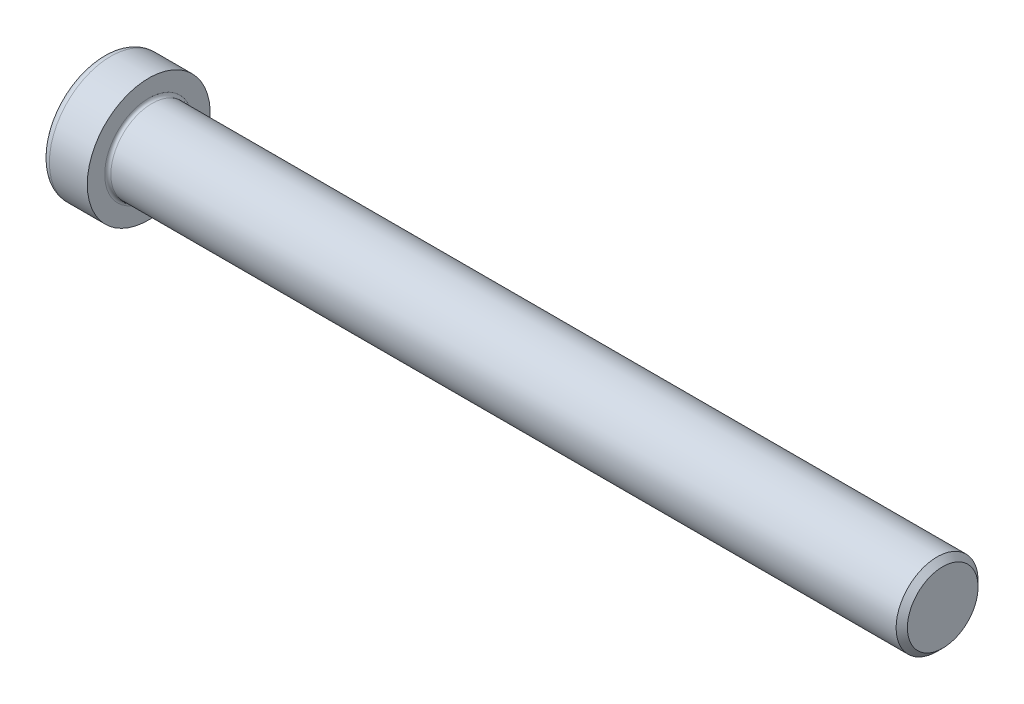
ISO-10303-21;
HEADER;
FILE_DESCRIPTION(('STEP AP214'),'2;1');
FILE_NAME('part.step','',(''),(''),'','','');
FILE_SCHEMA(('AUTOMOTIVE_DESIGN { 1 0 10303 214 1 1 1 1 }'));
ENDSEC;
DATA;
#1=APPLICATION_CONTEXT('core data for automotive mechanical design processes');
#2=APPLICATION_PROTOCOL_DEFINITION('international standard','automotive_design',2000,#1);
#3=PRODUCT_CONTEXT('',#1,'mechanical');
#4=PRODUCT('Part','Part','',(#3));
#5=PRODUCT_RELATED_PRODUCT_CATEGORY('part','',(#4));
#6=PRODUCT_DEFINITION_FORMATION('','',#4);
#7=PRODUCT_DEFINITION_CONTEXT('part definition',#1,'design');
#8=PRODUCT_DEFINITION('design','',#6,#7);
#9=PRODUCT_DEFINITION_SHAPE('','',#8);
#10=(LENGTH_UNIT() NAMED_UNIT(*) SI_UNIT(.MILLI.,.METRE.));
#11=(NAMED_UNIT(*) PLANE_ANGLE_UNIT() SI_UNIT($,.RADIAN.));
#12=(NAMED_UNIT(*) SI_UNIT($,.STERADIAN.) SOLID_ANGLE_UNIT());
#13=UNCERTAINTY_MEASURE_WITH_UNIT(LENGTH_MEASURE(1.E-05),#10,'distance_accuracy_value','');
#14=(GEOMETRIC_REPRESENTATION_CONTEXT(3) GLOBAL_UNCERTAINTY_ASSIGNED_CONTEXT((#13)) GLOBAL_UNIT_ASSIGNED_CONTEXT((#10,
#11,#12)) REPRESENTATION_CONTEXT('',''));
#15=CARTESIAN_POINT('',(0.,0.,0.));
#16=DIRECTION('',(0.,0.,1.));
#17=DIRECTION('',(1.,0.,0.));
#18=AXIS2_PLACEMENT_3D('',#15,#16,#17);
#19=CARTESIAN_POINT('',(0.,0.,0.));
#20=DIRECTION('',(-1.,0.,0.));
#21=DIRECTION('',(0.,0.,1.));
#22=AXIS2_PLACEMENT_3D('',#19,#20,#21);
#23=PLANE('',#22);
#24=DIRECTION('',(0.,-0.499999999999998,0.86602540378444));
#25=VECTOR('',#24,1.);
#26=CARTESIAN_POINT('',(0.,6.92820323027551,0.));
#27=LINE('',#26,#25);
#28=CARTESIAN_POINT('',(0.,6.92820323027551,0.));
#29=VERTEX_POINT('',#28);
#30=CARTESIAN_POINT('',(0.,3.46410161513777,5.99999999999999));
#31=VERTEX_POINT('',#30);
#32=EDGE_CURVE('E294',#29,#31,#27,.T.);
#33=ORIENTED_EDGE('',*,*,#32,.T.);
#34=DIRECTION('',(0.,1.,0.));
#35=VECTOR('',#34,1.);
#36=CARTESIAN_POINT('',(0.,-3.46410161513774,6.));
#37=LINE('',#36,#35);
#38=CARTESIAN_POINT('',(0.,-3.46410161513774,6.));
#39=VERTEX_POINT('',#38);
#40=EDGE_CURVE('E148',#39,#31,#37,.T.);
#41=ORIENTED_EDGE('',*,*,#40,.F.);
#42=DIRECTION('',(0.,-0.500000000000001,-0.866025403784438));
#43=VECTOR('',#42,1.);
#44=CARTESIAN_POINT('',(0.,-3.46410161513774,6.));
#45=LINE('',#44,#43);
#46=CARTESIAN_POINT('',(0.,-6.9282032302755,0.));
#47=VERTEX_POINT('',#46);
#48=EDGE_CURVE('E299',#39,#47,#45,.T.);
#49=ORIENTED_EDGE('',*,*,#48,.T.);
#50=DIRECTION('',(0.,0.499999999999998,-0.86602540378444));
#51=VECTOR('',#50,1.);
#52=CARTESIAN_POINT('',(0.,-6.9282032302755,0.));
#53=LINE('',#52,#51);
#54=CARTESIAN_POINT('',(0.,-3.46410161513776,-6.));
#55=VERTEX_POINT('',#54);
#56=EDGE_CURVE('E303',#47,#55,#53,.T.);
#57=ORIENTED_EDGE('',*,*,#56,.T.);
#58=DIRECTION('',(0.,-1.,0.));
#59=VECTOR('',#58,1.);
#60=CARTESIAN_POINT('',(0.,3.46410161513775,-6.00000000000001));
#61=LINE('',#60,#59);
#62=CARTESIAN_POINT('',(0.,3.46410161513775,-6.00000000000001));
#63=VERTEX_POINT('',#62);
#64=EDGE_CURVE('E307',#63,#55,#61,.T.);
#65=ORIENTED_EDGE('',*,*,#64,.F.);
#66=DIRECTION('',(0.,-0.500000000000001,-0.866025403784438));
#67=VECTOR('',#66,1.);
#68=CARTESIAN_POINT('',(0.,6.92820323027551,0.));
#69=LINE('',#68,#67);
#70=EDGE_CURVE('E143',#29,#63,#69,.T.);
#71=ORIENTED_EDGE('',*,*,#70,.F.);
#72=EDGE_LOOP('',(#33,#41,#49,#57,#65,#71));
#73=FACE_BOUND('',#72,.T.);
#74=CARTESIAN_POINT('',(0.,0.,0.));
#75=DIRECTION('',(-1.,0.,0.));
#76=DIRECTION('',(0.,0.,1.));
#77=AXIS2_PLACEMENT_3D('',#74,#75,#76);
#78=CIRCLE('',#77,10.4);
#79=CARTESIAN_POINT('',(0.,0.,10.4));
#80=VERTEX_POINT('',#79);
#81=EDGE_CURVE('E58',#80,#80,#78,.T.);
#82=ORIENTED_EDGE('',*,*,#81,.T.);
#83=EDGE_LOOP('',(#82));
#84=FACE_BOUND('',#83,.T.);
#85=ADVANCED_FACE('F49',(#73,#84),#23,.T.);
#86=CARTESIAN_POINT('',(-31.75,0.,0.));
#87=DIRECTION('',(-1.,0.,0.));
#88=DIRECTION('',(0.,0.,1.));
#89=AXIS2_PLACEMENT_3D('',#86,#87,#88);
#90=CYLINDRICAL_SURFACE('',#89,12.);
#91=CARTESIAN_POINT('',(1.6,0.,0.));
#92=DIRECTION('',(-1.,0.,0.));
#93=DIRECTION('',(0.,0.,1.));
#94=AXIS2_PLACEMENT_3D('',#91,#92,#93);
#95=CIRCLE('',#94,12.);
#96=CARTESIAN_POINT('',(1.6,0.,12.));
#97=VERTEX_POINT('',#96);
#98=EDGE_CURVE('E11',#97,#97,#95,.F.);
#99=ORIENTED_EDGE('',*,*,#98,.T.);
#100=EDGE_LOOP('',(#99));
#101=FACE_BOUND('',#100,.T.);
#102=CARTESIAN_POINT('',(9.,0.,0.));
#103=DIRECTION('',(-1.,0.,0.));
#104=DIRECTION('',(0.,0.,1.));
#105=AXIS2_PLACEMENT_3D('',#102,#103,#104);
#106=CIRCLE('',#105,12.);
#107=CARTESIAN_POINT('',(9.,0.,12.));
#108=VERTEX_POINT('',#107);
#109=EDGE_CURVE('E173',#108,#108,#106,.T.);
#110=ORIENTED_EDGE('',*,*,#109,.T.);
#111=EDGE_LOOP('',(#110));
#112=FACE_BOUND('',#111,.T.);
#113=ADVANCED_FACE('F203',(#101,#112),#90,.T.);
#114=CARTESIAN_POINT('',(9.,12.,0.));
#115=DIRECTION('',(1.,0.,0.));
#116=DIRECTION('',(0.,0.,-1.));
#117=AXIS2_PLACEMENT_3D('',#114,#115,#116);
#118=PLANE('',#117);
#119=CARTESIAN_POINT('',(9.,0.,0.));
#120=DIRECTION('',(1.,0.,0.));
#121=DIRECTION('',(0.,0.,-1.));
#122=AXIS2_PLACEMENT_3D('',#119,#120,#121);
#123=CIRCLE('',#122,8.6);
#124=CARTESIAN_POINT('',(9.,0.,-8.6));
#125=VERTEX_POINT('',#124);
#126=EDGE_CURVE('E177',#125,#125,#123,.F.);
#127=ORIENTED_EDGE('',*,*,#126,.T.);
#128=EDGE_LOOP('',(#127));
#129=FACE_BOUND('',#128,.T.);
#130=ORIENTED_EDGE('',*,*,#109,.F.);
#131=EDGE_LOOP('',(#130));
#132=FACE_BOUND('',#131,.T.);
#133=ADVANCED_FACE('F208',(#129,#132),#118,.T.);
#134=CARTESIAN_POINT('',(-31.75,0.,0.));
#135=DIRECTION('',(-1.,0.,0.));
#136=DIRECTION('',(0.,0.,1.));
#137=AXIS2_PLACEMENT_3D('',#134,#135,#136);
#138=CYLINDRICAL_SURFACE('',#137,8.);
#139=CARTESIAN_POINT('',(9.6,0.,0.));
#140=DIRECTION('',(1.,0.,0.));
#141=DIRECTION('',(0.,0.,-1.));
#142=AXIS2_PLACEMENT_3D('',#139,#140,#141);
#143=CIRCLE('',#142,8.);
#144=CARTESIAN_POINT('',(9.6,0.,-8.));
#145=VERTEX_POINT('',#144);
#146=EDGE_CURVE('E181',#145,#145,#143,.T.);
#147=ORIENTED_EDGE('',*,*,#146,.T.);
#148=EDGE_LOOP('',(#147));
#149=FACE_BOUND('',#148,.T.);
#150=CARTESIAN_POINT('',(162.8985,0.,0.));
#151=DIRECTION('',(-1.,0.,0.));
#152=DIRECTION('',(0.,0.,1.));
#153=AXIS2_PLACEMENT_3D('',#150,#151,#152);
#154=CIRCLE('',#153,8.);
#155=CARTESIAN_POINT('',(162.8985,0.,8.));
#156=VERTEX_POINT('',#155);
#157=EDGE_CURVE('E169',#156,#156,#154,.T.);
#158=ORIENTED_EDGE('',*,*,#157,.T.);
#159=EDGE_LOOP('',(#158));
#160=FACE_BOUND('',#159,.T.);
#161=ADVANCED_FACE('F214',(#149,#160),#138,.T.);
#162=CARTESIAN_POINT('',(164.,0.,0.));
#163=DIRECTION('',(-1.,0.,0.));
#164=DIRECTION('',(0.,0.,1.));
#165=AXIS2_PLACEMENT_3D('',#162,#163,#164);
#166=CONICAL_SURFACE('',#165,6.8985,0.785398163397432);
#167=ORIENTED_EDGE('',*,*,#157,.F.);
#168=EDGE_LOOP('',(#167));
#169=FACE_BOUND('',#168,.T.);
#170=CARTESIAN_POINT('',(164.,0.,0.));
#171=DIRECTION('',(-1.,0.,0.));
#172=DIRECTION('',(0.,0.,1.));
#173=AXIS2_PLACEMENT_3D('',#170,#171,#172);
#174=CIRCLE('',#173,6.8985);
#175=CARTESIAN_POINT('',(164.,0.,6.8985));
#176=VERTEX_POINT('',#175);
#177=EDGE_CURVE('E164',#176,#176,#174,.T.);
#178=ORIENTED_EDGE('',*,*,#177,.T.);
#179=EDGE_LOOP('',(#178));
#180=FACE_BOUND('',#179,.T.);
#181=ADVANCED_FACE('F218',(#169,#180),#166,.T.);
#182=CARTESIAN_POINT('',(164.,6.8985,0.));
#183=DIRECTION('',(1.,0.,0.));
#184=DIRECTION('',(0.,0.,-1.));
#185=AXIS2_PLACEMENT_3D('',#182,#183,#184);
#186=PLANE('',#185);
#187=ORIENTED_EDGE('',*,*,#177,.F.);
#188=EDGE_LOOP('',(#187));
#189=FACE_BOUND('',#188,.T.);
#190=ADVANCED_FACE('F200',(#189),#186,.T.);
#191=CARTESIAN_POINT('',(9.6,0.,0.));
#192=DIRECTION('',(1.,0.,0.));
#193=DIRECTION('',(0.,0.,-1.));
#194=AXIS2_PLACEMENT_3D('',#191,#192,#193);
#195=TOROIDAL_SURFACE('',#194,8.6,0.6);
#196=ORIENTED_EDGE('',*,*,#146,.F.);
#197=EDGE_LOOP('',(#196));
#198=FACE_BOUND('',#197,.T.);
#199=ORIENTED_EDGE('',*,*,#126,.F.);
#200=EDGE_LOOP('',(#199));
#201=FACE_BOUND('',#200,.T.);
#202=ADVANCED_FACE('F191',(#198,#201),#195,.F.);
#203=CARTESIAN_POINT('',(1.6,0.,0.));
#204=DIRECTION('',(-1.,0.,0.));
#205=DIRECTION('',(0.,0.,1.));
#206=AXIS2_PLACEMENT_3D('',#203,#204,#205);
#207=TOROIDAL_SURFACE('',#206,10.4,1.6);
#208=ORIENTED_EDGE('',*,*,#98,.F.);
#209=EDGE_LOOP('',(#208));
#210=FACE_BOUND('',#209,.T.);
#211=ORIENTED_EDGE('',*,*,#81,.F.);
#212=EDGE_LOOP('',(#211));
#213=FACE_BOUND('',#212,.T.);
#214=ADVANCED_FACE('F51',(#210,#213),#207,.T.);
#215=CARTESIAN_POINT('',(5.5,6.92820323027551,0.));
#216=DIRECTION('',(0.,-0.86602540378444,-0.499999999999998));
#217=DIRECTION('',(0.,0.499999999999998,-0.86602540378444));
#218=AXIS2_PLACEMENT_3D('',#215,#216,#217);
#219=PLANE('',#218);
#220=ORIENTED_EDGE('',*,*,#32,.F.);
#221=DIRECTION('',(-1.,0.,0.));
#222=VECTOR('',#221,1.);
#223=CARTESIAN_POINT('',(5.5,6.92820323027551,0.));
#224=LINE('',#223,#222);
#225=CARTESIAN_POINT('',(5.5,6.92820323027551,0.));
#226=VERTEX_POINT('',#225);
#227=EDGE_CURVE('E280',#226,#29,#224,.T.);
#228=ORIENTED_EDGE('',*,*,#227,.F.);
#229=DIRECTION('',(0.,-0.499999999999998,0.86602540378444));
#230=VECTOR('',#229,1.);
#231=CARTESIAN_POINT('',(5.5,6.92820323027551,0.));
#232=LINE('',#231,#230);
#233=CARTESIAN_POINT('',(5.5,5.19615242270664,2.99999999999999));
#234=VERTEX_POINT('',#233);
#235=EDGE_CURVE('E134',#226,#234,#232,.T.);
#236=ORIENTED_EDGE('',*,*,#235,.T.);
#237=CARTESIAN_POINT('',(5.5,3.46410161513777,5.99999999999999));
#238=VERTEX_POINT('',#237);
#239=EDGE_CURVE('E124',#234,#238,#232,.T.);
#240=ORIENTED_EDGE('',*,*,#239,.T.);
#241=DIRECTION('',(-1.,0.,0.));
#242=VECTOR('',#241,1.);
#243=CARTESIAN_POINT('',(5.5,3.46410161513777,5.99999999999999));
#244=LINE('',#243,#242);
#245=EDGE_CURVE('E139',#238,#31,#244,.T.);
#246=ORIENTED_EDGE('',*,*,#245,.T.);
#247=EDGE_LOOP('',(#220,#228,#236,#240,#246));
#248=FACE_BOUND('',#247,.T.);
#249=ADVANCED_FACE('F138',(#248),#219,.T.);
#250=CARTESIAN_POINT('',(5.5,-3.46410161513774,6.));
#251=DIRECTION('',(0.,0.,1.));
#252=DIRECTION('',(0.,-1.,0.));
#253=AXIS2_PLACEMENT_3D('',#250,#251,#252);
#254=PLANE('',#253);
#255=ORIENTED_EDGE('',*,*,#40,.T.);
#256=ORIENTED_EDGE('',*,*,#245,.F.);
#257=DIRECTION('',(0.,1.,0.));
#258=VECTOR('',#257,1.);
#259=CARTESIAN_POINT('',(5.5,-3.46410161513774,6.));
#260=LINE('',#259,#258);
#261=CARTESIAN_POINT('',(5.5,0.,6.));
#262=VERTEX_POINT('',#261);
#263=EDGE_CURVE('E121',#262,#238,#260,.T.);
#264=ORIENTED_EDGE('',*,*,#263,.F.);
#265=CARTESIAN_POINT('',(5.5,-3.46410161513774,6.));
#266=VERTEX_POINT('',#265);
#267=EDGE_CURVE('E133',#266,#262,#260,.T.);
#268=ORIENTED_EDGE('',*,*,#267,.F.);
#269=DIRECTION('',(-1.,0.,0.));
#270=VECTOR('',#269,1.);
#271=CARTESIAN_POINT('',(5.5,-3.46410161513774,6.));
#272=LINE('',#271,#270);
#273=EDGE_CURVE('E151',#266,#39,#272,.T.);
#274=ORIENTED_EDGE('',*,*,#273,.T.);
#275=EDGE_LOOP('',(#255,#256,#264,#268,#274));
#276=FACE_BOUND('',#275,.T.);
#277=ADVANCED_FACE('F145',(#276),#254,.F.);
#278=CARTESIAN_POINT('',(5.5,-3.46410161513774,6.));
#279=DIRECTION('',(0.,0.866025403784438,-0.500000000000001));
#280=DIRECTION('',(0.,0.500000000000001,0.866025403784438));
#281=AXIS2_PLACEMENT_3D('',#278,#279,#280);
#282=PLANE('',#281);
#283=ORIENTED_EDGE('',*,*,#48,.F.);
#284=ORIENTED_EDGE('',*,*,#273,.F.);
#285=DIRECTION('',(0.,-0.500000000000001,-0.866025403784438));
#286=VECTOR('',#285,1.);
#287=CARTESIAN_POINT('',(5.5,-3.46410161513774,6.));
#288=LINE('',#287,#286);
#289=CARTESIAN_POINT('',(5.5,-5.19615242270662,3.));
#290=VERTEX_POINT('',#289);
#291=EDGE_CURVE('E342',#266,#290,#288,.T.);
#292=ORIENTED_EDGE('',*,*,#291,.T.);
#293=CARTESIAN_POINT('',(5.5,-6.9282032302755,0.));
#294=VERTEX_POINT('',#293);
#295=EDGE_CURVE('E322',#290,#294,#288,.T.);
#296=ORIENTED_EDGE('',*,*,#295,.T.);
#297=DIRECTION('',(-1.,0.,0.));
#298=VECTOR('',#297,1.);
#299=CARTESIAN_POINT('',(5.5,-6.9282032302755,0.));
#300=LINE('',#299,#298);
#301=EDGE_CURVE('E159',#294,#47,#300,.T.);
#302=ORIENTED_EDGE('',*,*,#301,.T.);
#303=EDGE_LOOP('',(#283,#284,#292,#296,#302));
#304=FACE_BOUND('',#303,.T.);
#305=ADVANCED_FACE('F232',(#304),#282,.T.);
#306=CARTESIAN_POINT('',(5.5,-6.9282032302755,0.));
#307=DIRECTION('',(0.,0.86602540378444,0.499999999999998));
#308=DIRECTION('',(0.,-0.499999999999998,0.86602540378444));
#309=AXIS2_PLACEMENT_3D('',#306,#307,#308);
#310=PLANE('',#309);
#311=ORIENTED_EDGE('',*,*,#56,.F.);
#312=ORIENTED_EDGE('',*,*,#301,.F.);
#313=DIRECTION('',(0.,0.499999999999998,-0.86602540378444));
#314=VECTOR('',#313,1.);
#315=CARTESIAN_POINT('',(5.5,-6.9282032302755,0.));
#316=LINE('',#315,#314);
#317=CARTESIAN_POINT('',(5.5,-5.19615242270664,-2.99999999999998));
#318=VERTEX_POINT('',#317);
#319=EDGE_CURVE('E289',#294,#318,#316,.T.);
#320=ORIENTED_EDGE('',*,*,#319,.T.);
#321=CARTESIAN_POINT('',(5.5,-3.46410161513776,-6.));
#322=VERTEX_POINT('',#321);
#323=EDGE_CURVE('E340',#318,#322,#316,.T.);
#324=ORIENTED_EDGE('',*,*,#323,.T.);
#325=DIRECTION('',(-1.,0.,0.));
#326=VECTOR('',#325,1.);
#327=CARTESIAN_POINT('',(5.5,-3.46410161513776,-6.));
#328=LINE('',#327,#326);
#329=EDGE_CURVE('E279',#322,#55,#328,.T.);
#330=ORIENTED_EDGE('',*,*,#329,.T.);
#331=EDGE_LOOP('',(#311,#312,#320,#324,#330));
#332=FACE_BOUND('',#331,.T.);
#333=ADVANCED_FACE('F235',(#332),#310,.T.);
#334=CARTESIAN_POINT('',(5.5,3.46410161513775,-6.00000000000001));
#335=DIRECTION('',(0.,0.,-1.));
#336=DIRECTION('',(0.,1.,0.));
#337=AXIS2_PLACEMENT_3D('',#334,#335,#336);
#338=PLANE('',#337);
#339=ORIENTED_EDGE('',*,*,#64,.T.);
#340=ORIENTED_EDGE('',*,*,#329,.F.);
#341=DIRECTION('',(0.,-1.,0.));
#342=VECTOR('',#341,1.);
#343=CARTESIAN_POINT('',(5.5,3.46410161513775,-6.00000000000001));
#344=LINE('',#343,#342);
#345=CARTESIAN_POINT('',(5.5,0.,-6.));
#346=VERTEX_POINT('',#345);
#347=EDGE_CURVE('E283',#346,#322,#344,.T.);
#348=ORIENTED_EDGE('',*,*,#347,.F.);
#349=CARTESIAN_POINT('',(5.5,3.46410161513775,-6.00000000000001));
#350=VERTEX_POINT('',#349);
#351=EDGE_CURVE('E65',#350,#346,#344,.T.);
#352=ORIENTED_EDGE('',*,*,#351,.F.);
#353=DIRECTION('',(-1.,0.,0.));
#354=VECTOR('',#353,1.);
#355=CARTESIAN_POINT('',(5.5,3.46410161513775,-6.00000000000001));
#356=LINE('',#355,#354);
#357=EDGE_CURVE('E275',#350,#63,#356,.T.);
#358=ORIENTED_EDGE('',*,*,#357,.T.);
#359=EDGE_LOOP('',(#339,#340,#348,#352,#358));
#360=FACE_BOUND('',#359,.T.);
#361=ADVANCED_FACE('F239',(#360),#338,.F.);
#362=CARTESIAN_POINT('',(5.5,6.92820323027551,0.));
#363=DIRECTION('',(0.,0.866025403784438,-0.500000000000001));
#364=DIRECTION('',(0.,0.500000000000001,0.866025403784438));
#365=AXIS2_PLACEMENT_3D('',#362,#363,#364);
#366=PLANE('',#365);
#367=ORIENTED_EDGE('',*,*,#70,.T.);
#368=ORIENTED_EDGE('',*,*,#357,.F.);
#369=DIRECTION('',(0.,-0.500000000000001,-0.866025403784438));
#370=VECTOR('',#369,1.);
#371=CARTESIAN_POINT('',(5.5,6.92820323027551,0.));
#372=LINE('',#371,#370);
#373=CARTESIAN_POINT('',(5.5,5.19615242270663,-3.00000000000001));
#374=VERTEX_POINT('',#373);
#375=EDGE_CURVE('E264',#374,#350,#372,.T.);
#376=ORIENTED_EDGE('',*,*,#375,.F.);
#377=EDGE_CURVE('E271',#226,#374,#372,.T.);
#378=ORIENTED_EDGE('',*,*,#377,.F.);
#379=ORIENTED_EDGE('',*,*,#227,.T.);
#380=EDGE_LOOP('',(#367,#368,#376,#378,#379));
#381=FACE_BOUND('',#380,.T.);
#382=ADVANCED_FACE('F243',(#381),#366,.F.);
#383=CARTESIAN_POINT('',(5.5,10.3923048454132,-6.00000000000002));
#384=DIRECTION('',(1.,0.,0.));
#385=DIRECTION('',(0.,0.,-1.));
#386=AXIS2_PLACEMENT_3D('',#383,#384,#385);
#387=PLANE('',#386);
#388=ORIENTED_EDGE('',*,*,#347,.T.);
#389=ORIENTED_EDGE('',*,*,#323,.F.);
#390=CARTESIAN_POINT('',(5.5,0.,0.));
#391=DIRECTION('',(-1.,0.,0.));
#392=DIRECTION('',(0.,0.,1.));
#393=AXIS2_PLACEMENT_3D('',#390,#391,#392);
#394=CIRCLE('',#393,6.);
#395=EDGE_CURVE('E331',#346,#318,#394,.T.);
#396=ORIENTED_EDGE('',*,*,#395,.F.);
#397=EDGE_LOOP('',(#388,#389,#396));
#398=FACE_BOUND('',#397,.T.);
#399=ADVANCED_FACE('F247',(#398),#387,.F.);
#400=ORIENTED_EDGE('',*,*,#319,.F.);
#401=ORIENTED_EDGE('',*,*,#295,.F.);
#402=EDGE_CURVE('E157',#318,#290,#394,.T.);
#403=ORIENTED_EDGE('',*,*,#402,.F.);
#404=EDGE_LOOP('',(#400,#401,#403));
#405=FACE_BOUND('',#404,.T.);
#406=ADVANCED_FACE('F250',(#405),#387,.F.);
#407=ORIENTED_EDGE('',*,*,#291,.F.);
#408=ORIENTED_EDGE('',*,*,#267,.T.);
#409=EDGE_CURVE('E150',#290,#262,#394,.T.);
#410=ORIENTED_EDGE('',*,*,#409,.F.);
#411=EDGE_LOOP('',(#407,#408,#410));
#412=FACE_BOUND('',#411,.T.);
#413=ADVANCED_FACE('F255',(#412),#387,.F.);
#414=ORIENTED_EDGE('',*,*,#263,.T.);
#415=ORIENTED_EDGE('',*,*,#239,.F.);
#416=EDGE_CURVE('E127',#262,#234,#394,.T.);
#417=ORIENTED_EDGE('',*,*,#416,.F.);
#418=EDGE_LOOP('',(#414,#415,#417));
#419=FACE_BOUND('',#418,.T.);
#420=ADVANCED_FACE('F123',(#419),#387,.F.);
#421=ORIENTED_EDGE('',*,*,#235,.F.);
#422=ORIENTED_EDGE('',*,*,#377,.T.);
#423=EDGE_CURVE('E165',#234,#374,#394,.T.);
#424=ORIENTED_EDGE('',*,*,#423,.F.);
#425=EDGE_LOOP('',(#421,#422,#424));
#426=FACE_BOUND('',#425,.T.);
#427=ADVANCED_FACE('F258',(#426),#387,.F.);
#428=ORIENTED_EDGE('',*,*,#375,.T.);
#429=ORIENTED_EDGE('',*,*,#351,.T.);
#430=EDGE_CURVE('E267',#374,#346,#394,.T.);
#431=ORIENTED_EDGE('',*,*,#430,.F.);
#432=EDGE_LOOP('',(#428,#429,#431));
#433=FACE_BOUND('',#432,.T.);
#434=ADVANCED_FACE('F228',(#433),#387,.F.);
#435=CARTESIAN_POINT('',(5.5,0.,0.));
#436=DIRECTION('',(-1.,0.,0.));
#437=DIRECTION('',(0.,0.,1.));
#438=AXIS2_PLACEMENT_3D('',#435,#436,#437);
#439=CONICAL_SURFACE('',#438,6.,1.04719755119659);
#440=CARTESIAN_POINT('',(8.96410161513778,0.,0.));
#441=VERTEX_POINT('',#440);
#442=VERTEX_LOOP('',#441);
#443=FACE_BOUND('',#442,.T.);
#444=ORIENTED_EDGE('',*,*,#416,.T.);
#445=ORIENTED_EDGE('',*,*,#423,.T.);
#446=ORIENTED_EDGE('',*,*,#430,.T.);
#447=ORIENTED_EDGE('',*,*,#395,.T.);
#448=ORIENTED_EDGE('',*,*,#402,.T.);
#449=ORIENTED_EDGE('',*,*,#409,.T.);
#450=EDGE_LOOP('',(#444,#445,#446,#447,#448,#449));
#451=FACE_BOUND('',#450,.T.);
#452=ADVANCED_FACE('F226',(#443,#451),#439,.F.);
#453=CLOSED_SHELL('',(#85,#113,#133,#161,#181,#190,#202,#214,#249,#277,#305,#333,#361,#382,#399,
#406,#413,#420,#427,#434,#452));
#454=MANIFOLD_SOLID_BREP('B2',#453);
#455=ADVANCED_BREP_SHAPE_REPRESENTATION('',(#18,#454),#14);
#456=SHAPE_DEFINITION_REPRESENTATION(#9,#455);
ENDSEC;
END-ISO-10303-21;
